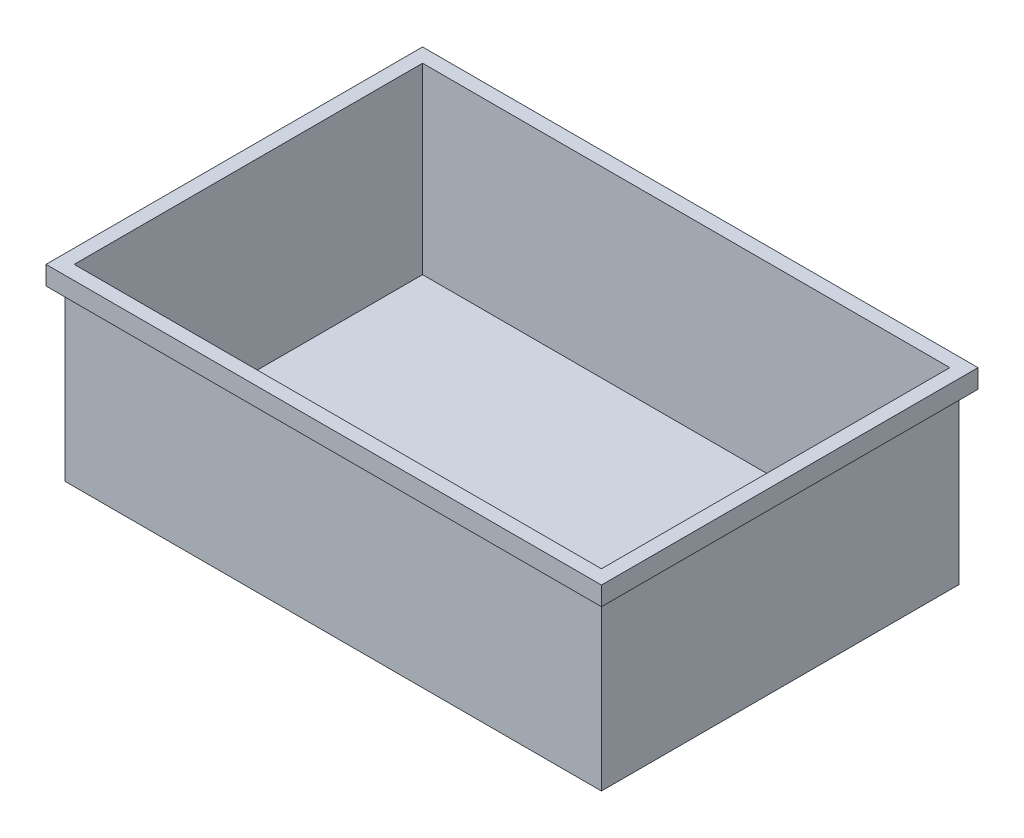
ISO-10303-21;
HEADER;
FILE_DESCRIPTION(('STEP AP214'),'2;1');
FILE_NAME('part.step','',(''),(''),'','','');
FILE_SCHEMA(('AUTOMOTIVE_DESIGN { 1 0 10303 214 1 1 1 1 }'));
ENDSEC;
DATA;
#1=APPLICATION_CONTEXT('core data for automotive mechanical design processes');
#2=APPLICATION_PROTOCOL_DEFINITION('international standard','automotive_design',2000,#1);
#3=PRODUCT_CONTEXT('',#1,'mechanical');
#4=PRODUCT('Part','Part','',(#3));
#5=PRODUCT_RELATED_PRODUCT_CATEGORY('part','',(#4));
#6=PRODUCT_DEFINITION_FORMATION('','',#4);
#7=PRODUCT_DEFINITION_CONTEXT('part definition',#1,'design');
#8=PRODUCT_DEFINITION('design','',#6,#7);
#9=PRODUCT_DEFINITION_SHAPE('','',#8);
#10=(LENGTH_UNIT() NAMED_UNIT(*) SI_UNIT(.MILLI.,.METRE.));
#11=(NAMED_UNIT(*) PLANE_ANGLE_UNIT() SI_UNIT($,.RADIAN.));
#12=(NAMED_UNIT(*) SI_UNIT($,.STERADIAN.) SOLID_ANGLE_UNIT());
#13=UNCERTAINTY_MEASURE_WITH_UNIT(LENGTH_MEASURE(1.E-05),#10,'distance_accuracy_value','');
#14=(GEOMETRIC_REPRESENTATION_CONTEXT(3) GLOBAL_UNCERTAINTY_ASSIGNED_CONTEXT((#13)) GLOBAL_UNIT_ASSIGNED_CONTEXT((#10,
#11,#12)) REPRESENTATION_CONTEXT('',''));
#15=CARTESIAN_POINT('',(0.,0.,0.));
#16=DIRECTION('',(0.,0.,1.));
#17=DIRECTION('',(1.,0.,0.));
#18=AXIS2_PLACEMENT_3D('',#15,#16,#17);
#19=CARTESIAN_POINT('',(0.,80.,0.));
#20=DIRECTION('',(0.,-1.,0.));
#21=DIRECTION('',(0.,0.,-1.));
#22=AXIS2_PLACEMENT_3D('',#19,#20,#21);
#23=PLANE('',#22);
#24=DIRECTION('',(0.,0.,1.));
#25=VECTOR('',#24,1.);
#26=CARTESIAN_POINT('',(2.,80.,0.));
#27=LINE('',#26,#25);
#28=CARTESIAN_POINT('',(2.,80.,-150.4));
#29=VERTEX_POINT('',#28);
#30=CARTESIAN_POINT('',(2.,80.,-2.));
#31=VERTEX_POINT('',#30);
#32=EDGE_CURVE('E216',#29,#31,#27,.T.);
#33=ORIENTED_EDGE('',*,*,#32,.F.);
#34=DIRECTION('',(-1.,0.,0.));
#35=VECTOR('',#34,1.);
#36=CARTESIAN_POINT('',(0.,80.,-150.4));
#37=LINE('',#36,#35);
#38=CARTESIAN_POINT('',(226.6,80.,-150.4));
#39=VERTEX_POINT('',#38);
#40=EDGE_CURVE('E205',#39,#29,#37,.T.);
#41=ORIENTED_EDGE('',*,*,#40,.F.);
#42=DIRECTION('',(0.,0.,-1.));
#43=VECTOR('',#42,1.);
#44=CARTESIAN_POINT('',(226.6,80.,-1.65076468097153E-13));
#45=LINE('',#44,#43);
#46=CARTESIAN_POINT('',(226.6,80.,-2.));
#47=VERTEX_POINT('',#46);
#48=EDGE_CURVE('E220',#47,#39,#45,.T.);
#49=ORIENTED_EDGE('',*,*,#48,.F.);
#50=DIRECTION('',(1.,0.,0.));
#51=VECTOR('',#50,1.);
#52=CARTESIAN_POINT('',(0.,80.,-2.));
#53=LINE('',#52,#51);
#54=EDGE_CURVE('E218',#31,#47,#53,.T.);
#55=ORIENTED_EDGE('',*,*,#54,.F.);
#56=EDGE_LOOP('',(#33,#41,#49,#55));
#57=FACE_BOUND('',#56,.T.);
#58=DIRECTION('',(1.,0.,0.));
#59=VECTOR('',#58,1.);
#60=CARTESIAN_POINT('',(-4.,80.,4.));
#61=LINE('',#60,#59);
#62=CARTESIAN_POINT('',(-4.,80.,4.));
#63=VERTEX_POINT('',#62);
#64=CARTESIAN_POINT('',(232.6,80.,4.));
#65=VERTEX_POINT('',#64);
#66=EDGE_CURVE('E269',#63,#65,#61,.T.);
#67=ORIENTED_EDGE('',*,*,#66,.T.);
#68=DIRECTION('',(0.,0.,-1.));
#69=VECTOR('',#68,1.);
#70=CARTESIAN_POINT('',(232.6,80.,4.));
#71=LINE('',#70,#69);
#72=CARTESIAN_POINT('',(232.6,80.,-156.4));
#73=VERTEX_POINT('',#72);
#74=EDGE_CURVE('E271',#65,#73,#71,.T.);
#75=ORIENTED_EDGE('',*,*,#74,.T.);
#76=DIRECTION('',(-1.,0.,0.));
#77=VECTOR('',#76,1.);
#78=CARTESIAN_POINT('',(232.6,80.,-156.4));
#79=LINE('',#78,#77);
#80=CARTESIAN_POINT('',(-4.,80.,-156.4));
#81=VERTEX_POINT('',#80);
#82=EDGE_CURVE('E184',#73,#81,#79,.T.);
#83=ORIENTED_EDGE('',*,*,#82,.T.);
#84=DIRECTION('',(0.,0.,1.));
#85=VECTOR('',#84,1.);
#86=CARTESIAN_POINT('',(-4.,80.,-156.4));
#87=LINE('',#86,#85);
#88=EDGE_CURVE('E190',#81,#63,#87,.T.);
#89=ORIENTED_EDGE('',*,*,#88,.T.);
#90=EDGE_LOOP('',(#67,#75,#83,#89));
#91=FACE_BOUND('',#90,.T.);
#92=ADVANCED_FACE('F43',(#57,#91),#23,.F.);
#93=CARTESIAN_POINT('',(2.,80.,0.));
#94=DIRECTION('',(1.,0.,0.));
#95=DIRECTION('',(0.,0.,-1.));
#96=AXIS2_PLACEMENT_3D('',#93,#94,#95);
#97=PLANE('',#96);
#98=DIRECTION('',(0.,-1.,0.));
#99=VECTOR('',#98,1.);
#100=CARTESIAN_POINT('',(2.,80.,-2.));
#101=LINE('',#100,#99);
#102=CARTESIAN_POINT('',(2.,2.,-2.));
#103=VERTEX_POINT('',#102);
#104=EDGE_CURVE('E198',#31,#103,#101,.T.);
#105=ORIENTED_EDGE('',*,*,#104,.T.);
#106=DIRECTION('',(0.,0.,1.));
#107=VECTOR('',#106,1.);
#108=CARTESIAN_POINT('',(2.,2.,0.));
#109=LINE('',#108,#107);
#110=CARTESIAN_POINT('',(2.,2.,-150.4));
#111=VERTEX_POINT('',#110);
#112=EDGE_CURVE('E194',#111,#103,#109,.T.);
#113=ORIENTED_EDGE('',*,*,#112,.F.);
#114=DIRECTION('',(0.,-1.,0.));
#115=VECTOR('',#114,1.);
#116=CARTESIAN_POINT('',(2.,80.,-150.4));
#117=LINE('',#116,#115);
#118=EDGE_CURVE('E202',#29,#111,#117,.T.);
#119=ORIENTED_EDGE('',*,*,#118,.F.);
#120=ORIENTED_EDGE('',*,*,#32,.T.);
#121=EDGE_LOOP('',(#105,#113,#119,#120));
#122=FACE_BOUND('',#121,.T.);
#123=ADVANCED_FACE('F282',(#122),#97,.T.);
#124=CARTESIAN_POINT('',(0.,80.,-2.));
#125=DIRECTION('',(0.,0.,-1.));
#126=DIRECTION('',(-1.,0.,0.));
#127=AXIS2_PLACEMENT_3D('',#124,#125,#126);
#128=PLANE('',#127);
#129=DIRECTION('',(0.,-1.,0.));
#130=VECTOR('',#129,1.);
#131=CARTESIAN_POINT('',(226.6,80.,-2.));
#132=LINE('',#131,#130);
#133=CARTESIAN_POINT('',(226.6,2.,-2.));
#134=VERTEX_POINT('',#133);
#135=EDGE_CURVE('E201',#47,#134,#132,.T.);
#136=ORIENTED_EDGE('',*,*,#135,.T.);
#137=DIRECTION('',(1.,0.,0.));
#138=VECTOR('',#137,1.);
#139=CARTESIAN_POINT('',(0.,2.,-2.));
#140=LINE('',#139,#138);
#141=EDGE_CURVE('E197',#103,#134,#140,.T.);
#142=ORIENTED_EDGE('',*,*,#141,.F.);
#143=ORIENTED_EDGE('',*,*,#104,.F.);
#144=ORIENTED_EDGE('',*,*,#54,.T.);
#145=EDGE_LOOP('',(#136,#142,#143,#144));
#146=FACE_BOUND('',#145,.T.);
#147=ADVANCED_FACE('F290',(#146),#128,.T.);
#148=CARTESIAN_POINT('',(226.6,80.,0.));
#149=DIRECTION('',(-1.,0.,0.));
#150=DIRECTION('',(0.,0.,1.));
#151=AXIS2_PLACEMENT_3D('',#148,#149,#150);
#152=PLANE('',#151);
#153=DIRECTION('',(0.,-1.,0.));
#154=VECTOR('',#153,1.);
#155=CARTESIAN_POINT('',(226.6,80.,-150.4));
#156=LINE('',#155,#154);
#157=CARTESIAN_POINT('',(226.6,2.,-150.4));
#158=VERTEX_POINT('',#157);
#159=EDGE_CURVE('E204',#39,#158,#156,.T.);
#160=ORIENTED_EDGE('',*,*,#159,.T.);
#161=DIRECTION('',(0.,0.,-1.));
#162=VECTOR('',#161,1.);
#163=CARTESIAN_POINT('',(226.6,2.,-1.65076468097153E-13));
#164=LINE('',#163,#162);
#165=EDGE_CURVE('E208',#134,#158,#164,.T.);
#166=ORIENTED_EDGE('',*,*,#165,.F.);
#167=ORIENTED_EDGE('',*,*,#135,.F.);
#168=ORIENTED_EDGE('',*,*,#48,.T.);
#169=EDGE_LOOP('',(#160,#166,#167,#168));
#170=FACE_BOUND('',#169,.T.);
#171=ADVANCED_FACE('F414',(#170),#152,.T.);
#172=CARTESIAN_POINT('',(0.,80.,-150.4));
#173=DIRECTION('',(0.,0.,1.));
#174=DIRECTION('',(1.,0.,0.));
#175=AXIS2_PLACEMENT_3D('',#172,#173,#174);
#176=PLANE('',#175);
#177=ORIENTED_EDGE('',*,*,#118,.T.);
#178=DIRECTION('',(-1.,0.,0.));
#179=VECTOR('',#178,1.);
#180=CARTESIAN_POINT('',(0.,2.,-150.4));
#181=LINE('',#180,#179);
#182=EDGE_CURVE('E212',#158,#111,#181,.T.);
#183=ORIENTED_EDGE('',*,*,#182,.F.);
#184=ORIENTED_EDGE('',*,*,#159,.F.);
#185=ORIENTED_EDGE('',*,*,#40,.T.);
#186=EDGE_LOOP('',(#177,#183,#184,#185));
#187=FACE_BOUND('',#186,.T.);
#188=ADVANCED_FACE('F410',(#187),#176,.T.);
#189=CARTESIAN_POINT('',(0.,2.,0.));
#190=DIRECTION('',(0.,-1.,0.));
#191=DIRECTION('',(0.,0.,-1.));
#192=AXIS2_PLACEMENT_3D('',#189,#190,#191);
#193=PLANE('',#192);
#194=ORIENTED_EDGE('',*,*,#112,.T.);
#195=ORIENTED_EDGE('',*,*,#141,.T.);
#196=ORIENTED_EDGE('',*,*,#165,.T.);
#197=ORIENTED_EDGE('',*,*,#182,.T.);
#198=EDGE_LOOP('',(#194,#195,#196,#197));
#199=FACE_BOUND('',#198,.T.);
#200=ADVANCED_FACE('F296',(#199),#193,.F.);
#201=CARTESIAN_POINT('',(-4.,70.,4.));
#202=DIRECTION('',(0.,0.,1.));
#203=DIRECTION('',(1.,0.,0.));
#204=AXIS2_PLACEMENT_3D('',#201,#202,#203);
#205=PLANE('',#204);
#206=DIRECTION('',(0.,1.,0.));
#207=VECTOR('',#206,1.);
#208=CARTESIAN_POINT('',(-4.,70.,4.));
#209=LINE('',#208,#207);
#210=CARTESIAN_POINT('',(-4.,72.,4.));
#211=VERTEX_POINT('',#210);
#212=EDGE_CURVE('E188',#211,#63,#209,.T.);
#213=ORIENTED_EDGE('',*,*,#212,.F.);
#214=DIRECTION('',(1.,0.,0.));
#215=VECTOR('',#214,1.);
#216=CARTESIAN_POINT('',(232.6,72.,4.));
#217=LINE('',#216,#215);
#218=CARTESIAN_POINT('',(232.6,72.,4.));
#219=VERTEX_POINT('',#218);
#220=EDGE_CURVE('E11',#211,#219,#217,.T.);
#221=ORIENTED_EDGE('',*,*,#220,.T.);
#222=DIRECTION('',(0.,1.,0.));
#223=VECTOR('',#222,1.);
#224=CARTESIAN_POINT('',(232.6,70.,4.));
#225=LINE('',#224,#223);
#226=EDGE_CURVE('E92',#219,#65,#225,.T.);
#227=ORIENTED_EDGE('',*,*,#226,.T.);
#228=ORIENTED_EDGE('',*,*,#66,.F.);
#229=EDGE_LOOP('',(#213,#221,#227,#228));
#230=FACE_BOUND('',#229,.T.);
#231=ADVANCED_FACE('F280',(#230),#205,.T.);
#232=CARTESIAN_POINT('',(-4.,70.,-156.4));
#233=DIRECTION('',(-1.,0.,0.));
#234=DIRECTION('',(0.,0.,1.));
#235=AXIS2_PLACEMENT_3D('',#232,#233,#234);
#236=PLANE('',#235);
#237=DIRECTION('',(0.,1.,0.));
#238=VECTOR('',#237,1.);
#239=CARTESIAN_POINT('',(-4.,70.,-156.4));
#240=LINE('',#239,#238);
#241=CARTESIAN_POINT('',(-4.,72.,-156.4));
#242=VERTEX_POINT('',#241);
#243=EDGE_CURVE('E186',#242,#81,#240,.T.);
#244=ORIENTED_EDGE('',*,*,#243,.F.);
#245=DIRECTION('',(0.,0.,1.));
#246=VECTOR('',#245,1.);
#247=CARTESIAN_POINT('',(-4.,72.,4.));
#248=LINE('',#247,#246);
#249=EDGE_CURVE('E54',#242,#211,#248,.T.);
#250=ORIENTED_EDGE('',*,*,#249,.T.);
#251=ORIENTED_EDGE('',*,*,#212,.T.);
#252=ORIENTED_EDGE('',*,*,#88,.F.);
#253=EDGE_LOOP('',(#244,#250,#251,#252));
#254=FACE_BOUND('',#253,.T.);
#255=ADVANCED_FACE('F279',(#254),#236,.T.);
#256=CARTESIAN_POINT('',(232.6,70.,-156.4));
#257=DIRECTION('',(0.,0.,-1.));
#258=DIRECTION('',(-1.,0.,0.));
#259=AXIS2_PLACEMENT_3D('',#256,#257,#258);
#260=PLANE('',#259);
#261=DIRECTION('',(0.,1.,0.));
#262=VECTOR('',#261,1.);
#263=CARTESIAN_POINT('',(232.6,70.,-156.4));
#264=LINE('',#263,#262);
#265=CARTESIAN_POINT('',(232.6,72.,-156.4));
#266=VERTEX_POINT('',#265);
#267=EDGE_CURVE('E177',#266,#73,#264,.T.);
#268=ORIENTED_EDGE('',*,*,#267,.F.);
#269=DIRECTION('',(-1.,0.,0.));
#270=VECTOR('',#269,1.);
#271=CARTESIAN_POINT('',(-4.,72.,-156.4));
#272=LINE('',#271,#270);
#273=EDGE_CURVE('E170',#266,#242,#272,.T.);
#274=ORIENTED_EDGE('',*,*,#273,.T.);
#275=ORIENTED_EDGE('',*,*,#243,.T.);
#276=ORIENTED_EDGE('',*,*,#82,.F.);
#277=EDGE_LOOP('',(#268,#274,#275,#276));
#278=FACE_BOUND('',#277,.T.);
#279=ADVANCED_FACE('F182',(#278),#260,.T.);
#280=CARTESIAN_POINT('',(232.6,70.,4.));
#281=DIRECTION('',(1.,0.,0.));
#282=DIRECTION('',(0.,0.,-1.));
#283=AXIS2_PLACEMENT_3D('',#280,#281,#282);
#284=PLANE('',#283);
#285=ORIENTED_EDGE('',*,*,#226,.F.);
#286=DIRECTION('',(0.,0.,-1.));
#287=VECTOR('',#286,1.);
#288=CARTESIAN_POINT('',(232.6,72.,-156.4));
#289=LINE('',#288,#287);
#290=EDGE_CURVE('E160',#219,#266,#289,.T.);
#291=ORIENTED_EDGE('',*,*,#290,.T.);
#292=ORIENTED_EDGE('',*,*,#267,.T.);
#293=ORIENTED_EDGE('',*,*,#74,.F.);
#294=EDGE_LOOP('',(#285,#291,#292,#293));
#295=FACE_BOUND('',#294,.T.);
#296=ADVANCED_FACE('F176',(#295),#284,.T.);
#297=CARTESIAN_POINT('',(0.,0.,0.));
#298=DIRECTION('',(0.,-1.,0.));
#299=DIRECTION('',(0.,0.,-1.));
#300=AXIS2_PLACEMENT_3D('',#297,#298,#299);
#301=PLANE('',#300);
#302=DIRECTION('',(0.,0.,1.));
#303=VECTOR('',#302,1.);
#304=CARTESIAN_POINT('',(0.,0.,0.));
#305=LINE('',#304,#303);
#306=CARTESIAN_POINT('',(0.,0.,-152.4));
#307=VERTEX_POINT('',#306);
#308=CARTESIAN_POINT('',(0.,0.,0.));
#309=VERTEX_POINT('',#308);
#310=EDGE_CURVE('E200',#307,#309,#305,.T.);
#311=ORIENTED_EDGE('',*,*,#310,.F.);
#312=DIRECTION('',(-1.,0.,0.));
#313=VECTOR('',#312,1.);
#314=CARTESIAN_POINT('',(0.,0.,-152.4));
#315=LINE('',#314,#313);
#316=CARTESIAN_POINT('',(228.6,0.,-152.4));
#317=VERTEX_POINT('',#316);
#318=EDGE_CURVE('E232',#317,#307,#315,.T.);
#319=ORIENTED_EDGE('',*,*,#318,.F.);
#320=DIRECTION('',(0.,0.,-1.));
#321=VECTOR('',#320,1.);
#322=CARTESIAN_POINT('',(228.6,0.,0.));
#323=LINE('',#322,#321);
#324=CARTESIAN_POINT('',(228.6,0.,0.));
#325=VERTEX_POINT('',#324);
#326=EDGE_CURVE('E229',#325,#317,#323,.T.);
#327=ORIENTED_EDGE('',*,*,#326,.F.);
#328=DIRECTION('',(1.,0.,0.));
#329=VECTOR('',#328,1.);
#330=CARTESIAN_POINT('',(0.,0.,0.));
#331=LINE('',#330,#329);
#332=EDGE_CURVE('E226',#309,#325,#331,.T.);
#333=ORIENTED_EDGE('',*,*,#332,.F.);
#334=EDGE_LOOP('',(#311,#319,#327,#333));
#335=FACE_BOUND('',#334,.T.);
#336=ADVANCED_FACE('F298',(#335),#301,.T.);
#337=CARTESIAN_POINT('',(0.,80.,-152.4));
#338=DIRECTION('',(0.,0.,1.));
#339=DIRECTION('',(1.,0.,0.));
#340=AXIS2_PLACEMENT_3D('',#337,#338,#339);
#341=PLANE('',#340);
#342=DIRECTION('',(0.,-1.,0.));
#343=VECTOR('',#342,1.);
#344=CARTESIAN_POINT('',(0.,80.,-152.4));
#345=LINE('',#344,#343);
#346=CARTESIAN_POINT('',(0.,68.,-152.4));
#347=VERTEX_POINT('',#346);
#348=EDGE_CURVE('E235',#347,#307,#345,.T.);
#349=ORIENTED_EDGE('',*,*,#348,.F.);
#350=DIRECTION('',(1.,0.,0.));
#351=VECTOR('',#350,1.);
#352=CARTESIAN_POINT('',(228.6,68.,-152.4));
#353=LINE('',#352,#351);
#354=CARTESIAN_POINT('',(228.6,68.,-152.4));
#355=VERTEX_POINT('',#354);
#356=EDGE_CURVE('E180',#347,#355,#353,.T.);
#357=ORIENTED_EDGE('',*,*,#356,.T.);
#358=DIRECTION('',(0.,-1.,0.));
#359=VECTOR('',#358,1.);
#360=CARTESIAN_POINT('',(228.6,80.,-152.4));
#361=LINE('',#360,#359);
#362=EDGE_CURVE('E237',#355,#317,#361,.T.);
#363=ORIENTED_EDGE('',*,*,#362,.T.);
#364=ORIENTED_EDGE('',*,*,#318,.T.);
#365=EDGE_LOOP('',(#349,#357,#363,#364));
#366=FACE_BOUND('',#365,.T.);
#367=ADVANCED_FACE('F301',(#366),#341,.F.);
#368=CARTESIAN_POINT('',(228.6,80.,0.));
#369=DIRECTION('',(-1.,0.,0.));
#370=DIRECTION('',(0.,0.,1.));
#371=AXIS2_PLACEMENT_3D('',#368,#369,#370);
#372=PLANE('',#371);
#373=ORIENTED_EDGE('',*,*,#362,.F.);
#374=DIRECTION('',(0.,0.,1.));
#375=VECTOR('',#374,1.);
#376=CARTESIAN_POINT('',(228.6,68.,0.));
#377=LINE('',#376,#375);
#378=CARTESIAN_POINT('',(228.6,68.,0.));
#379=VERTEX_POINT('',#378);
#380=EDGE_CURVE('E243',#355,#379,#377,.T.);
#381=ORIENTED_EDGE('',*,*,#380,.T.);
#382=DIRECTION('',(0.,-1.,0.));
#383=VECTOR('',#382,1.);
#384=CARTESIAN_POINT('',(228.6,80.,0.));
#385=LINE('',#384,#383);
#386=EDGE_CURVE('E239',#379,#325,#385,.T.);
#387=ORIENTED_EDGE('',*,*,#386,.T.);
#388=ORIENTED_EDGE('',*,*,#326,.T.);
#389=EDGE_LOOP('',(#373,#381,#387,#388));
#390=FACE_BOUND('',#389,.T.);
#391=ADVANCED_FACE('F305',(#390),#372,.F.);
#392=CARTESIAN_POINT('',(0.,80.,0.));
#393=DIRECTION('',(0.,0.,-1.));
#394=DIRECTION('',(-1.,0.,0.));
#395=AXIS2_PLACEMENT_3D('',#392,#393,#394);
#396=PLANE('',#395);
#397=ORIENTED_EDGE('',*,*,#386,.F.);
#398=DIRECTION('',(-1.,0.,0.));
#399=VECTOR('',#398,1.);
#400=CARTESIAN_POINT('',(0.,68.,0.));
#401=LINE('',#400,#399);
#402=CARTESIAN_POINT('',(0.,68.,0.));
#403=VERTEX_POINT('',#402);
#404=EDGE_CURVE('E246',#379,#403,#401,.T.);
#405=ORIENTED_EDGE('',*,*,#404,.T.);
#406=DIRECTION('',(0.,-1.,0.));
#407=VECTOR('',#406,1.);
#408=CARTESIAN_POINT('',(0.,80.,0.));
#409=LINE('',#408,#407);
#410=EDGE_CURVE('E241',#403,#309,#409,.T.);
#411=ORIENTED_EDGE('',*,*,#410,.T.);
#412=ORIENTED_EDGE('',*,*,#332,.T.);
#413=EDGE_LOOP('',(#397,#405,#411,#412));
#414=FACE_BOUND('',#413,.T.);
#415=ADVANCED_FACE('F309',(#414),#396,.F.);
#416=CARTESIAN_POINT('',(0.,80.,0.));
#417=DIRECTION('',(1.,0.,0.));
#418=DIRECTION('',(0.,0.,-1.));
#419=AXIS2_PLACEMENT_3D('',#416,#417,#418);
#420=PLANE('',#419);
#421=ORIENTED_EDGE('',*,*,#410,.F.);
#422=DIRECTION('',(0.,0.,-1.));
#423=VECTOR('',#422,1.);
#424=CARTESIAN_POINT('',(0.,68.,-152.4));
#425=LINE('',#424,#423);
#426=EDGE_CURVE('E248',#403,#347,#425,.T.);
#427=ORIENTED_EDGE('',*,*,#426,.T.);
#428=ORIENTED_EDGE('',*,*,#348,.T.);
#429=ORIENTED_EDGE('',*,*,#310,.T.);
#430=EDGE_LOOP('',(#421,#427,#428,#429));
#431=FACE_BOUND('',#430,.T.);
#432=ADVANCED_FACE('F313',(#431),#420,.F.);
#433=CARTESIAN_POINT('',(-4.,72.,-156.4));
#434=DIRECTION('',(-0.707106781186538,-0.707106781186557,0.));
#435=DIRECTION('',(0.,0.,-1.));
#436=AXIS2_PLACEMENT_3D('',#433,#434,#435);
#437=PLANE('',#436);
#438=DIRECTION('',(0.577350269189631,-0.577350269189615,-0.577350269189631));
#439=VECTOR('',#438,1.);
#440=CARTESIAN_POINT('',(-4.,72.,4.));
#441=LINE('',#440,#439);
#442=CARTESIAN_POINT('',(-2.,70.,2.));
#443=VERTEX_POINT('',#442);
#444=EDGE_CURVE('E48',#211,#443,#441,.T.);
#445=ORIENTED_EDGE('',*,*,#444,.F.);
#446=ORIENTED_EDGE('',*,*,#249,.F.);
#447=DIRECTION('',(0.577350269189631,-0.577350269189615,0.577350269189631));
#448=VECTOR('',#447,1.);
#449=CARTESIAN_POINT('',(-4.,72.,-156.4));
#450=LINE('',#449,#448);
#451=CARTESIAN_POINT('',(-2.,70.,-154.4));
#452=VERTEX_POINT('',#451);
#453=EDGE_CURVE('E79',#452,#242,#450,.F.);
#454=ORIENTED_EDGE('',*,*,#453,.F.);
#455=DIRECTION('',(0.,0.,-1.));
#456=VECTOR('',#455,1.);
#457=CARTESIAN_POINT('',(-1.99999999999994,70.,-156.4));
#458=LINE('',#457,#456);
#459=EDGE_CURVE('E268',#443,#452,#458,.T.);
#460=ORIENTED_EDGE('',*,*,#459,.F.);
#461=EDGE_LOOP('',(#445,#446,#454,#460));
#462=FACE_BOUND('',#461,.T.);
#463=ADVANCED_FACE('F46',(#462),#437,.T.);
#464=CARTESIAN_POINT('',(-4.,72.,4.));
#465=DIRECTION('',(0.,-0.707106781186557,0.707106781186538));
#466=DIRECTION('',(-1.,0.,0.));
#467=AXIS2_PLACEMENT_3D('',#464,#465,#466);
#468=PLANE('',#467);
#469=ORIENTED_EDGE('',*,*,#220,.F.);
#470=ORIENTED_EDGE('',*,*,#444,.T.);
#471=DIRECTION('',(-1.,0.,0.));
#472=VECTOR('',#471,1.);
#473=CARTESIAN_POINT('',(-4.,70.,1.99999999999994));
#474=LINE('',#473,#472);
#475=CARTESIAN_POINT('',(230.6,70.,2.));
#476=VERTEX_POINT('',#475);
#477=EDGE_CURVE('E262',#476,#443,#474,.T.);
#478=ORIENTED_EDGE('',*,*,#477,.F.);
#479=DIRECTION('',(0.577350269189631,0.577350269189615,0.577350269189631));
#480=VECTOR('',#479,1.);
#481=CARTESIAN_POINT('',(153.733333333332,-6.86666666666594,-74.8666666666681));
#482=LINE('',#481,#480);
#483=EDGE_CURVE('E167',#219,#476,#482,.F.);
#484=ORIENTED_EDGE('',*,*,#483,.F.);
#485=EDGE_LOOP('',(#469,#470,#478,#484));
#486=FACE_BOUND('',#485,.T.);
#487=ADVANCED_FACE('F356',(#486),#468,.T.);
#488=CARTESIAN_POINT('',(232.6,72.,-156.4));
#489=DIRECTION('',(0.,-0.707106781186557,-0.707106781186538));
#490=DIRECTION('',(1.,0.,0.));
#491=AXIS2_PLACEMENT_3D('',#488,#489,#490);
#492=PLANE('',#491);
#493=ORIENTED_EDGE('',*,*,#453,.T.);
#494=ORIENTED_EDGE('',*,*,#273,.F.);
#495=DIRECTION('',(-0.57735026918963,-0.577350269189615,0.577350269189631));
#496=VECTOR('',#495,1.);
#497=CARTESIAN_POINT('',(232.6,72.,-156.4));
#498=LINE('',#497,#496);
#499=CARTESIAN_POINT('',(230.6,70.,-154.4));
#500=VERTEX_POINT('',#499);
#501=EDGE_CURVE('E155',#500,#266,#498,.F.);
#502=ORIENTED_EDGE('',*,*,#501,.F.);
#503=DIRECTION('',(1.,0.,0.));
#504=VECTOR('',#503,1.);
#505=CARTESIAN_POINT('',(232.6,70.,-154.4));
#506=LINE('',#505,#504);
#507=EDGE_CURVE('E168',#452,#500,#506,.T.);
#508=ORIENTED_EDGE('',*,*,#507,.F.);
#509=EDGE_LOOP('',(#493,#494,#502,#508));
#510=FACE_BOUND('',#509,.T.);
#511=ADVANCED_FACE('F171',(#510),#492,.T.);
#512=CARTESIAN_POINT('',(-2.,70.,0.));
#513=DIRECTION('',(-0.707106781186547,-0.707106781186547,0.));
#514=DIRECTION('',(0.,0.,-1.));
#515=AXIS2_PLACEMENT_3D('',#512,#513,#514);
#516=PLANE('',#515);
#517=DIRECTION('',(-0.577350269189626,0.577350269189626,-0.577350269189626));
#518=VECTOR('',#517,1.);
#519=CARTESIAN_POINT('',(-1.33333333333333,69.3333333333333,-153.733333333333));
#520=LINE('',#519,#518);
#521=EDGE_CURVE('E257',#347,#452,#520,.T.);
#522=ORIENTED_EDGE('',*,*,#521,.F.);
#523=ORIENTED_EDGE('',*,*,#426,.F.);
#524=DIRECTION('',(-0.577350269189626,0.577350269189626,0.577350269189626));
#525=VECTOR('',#524,1.);
#526=CARTESIAN_POINT('',(-1.33333333333333,69.3333333333333,1.33333333333333));
#527=LINE('',#526,#525);
#528=EDGE_CURVE('E265',#443,#403,#527,.F.);
#529=ORIENTED_EDGE('',*,*,#528,.F.);
#530=ORIENTED_EDGE('',*,*,#459,.T.);
#531=EDGE_LOOP('',(#522,#523,#529,#530));
#532=FACE_BOUND('',#531,.T.);
#533=ADVANCED_FACE('F344',(#532),#516,.T.);
#534=CARTESIAN_POINT('',(0.,70.,2.));
#535=DIRECTION('',(0.,-0.707106781186547,0.707106781186547));
#536=DIRECTION('',(-1.,0.,0.));
#537=AXIS2_PLACEMENT_3D('',#534,#535,#536);
#538=PLANE('',#537);
#539=ORIENTED_EDGE('',*,*,#528,.T.);
#540=ORIENTED_EDGE('',*,*,#404,.F.);
#541=DIRECTION('',(0.577350269189626,0.577350269189626,0.577350269189626));
#542=VECTOR('',#541,1.);
#543=CARTESIAN_POINT('',(153.733333333333,-6.8666666666667,-74.8666666666667));
#544=LINE('',#543,#542);
#545=EDGE_CURVE('E255',#476,#379,#544,.F.);
#546=ORIENTED_EDGE('',*,*,#545,.F.);
#547=ORIENTED_EDGE('',*,*,#477,.T.);
#548=EDGE_LOOP('',(#539,#540,#546,#547));
#549=FACE_BOUND('',#548,.T.);
#550=ADVANCED_FACE('F338',(#549),#538,.T.);
#551=CARTESIAN_POINT('',(232.6,72.,4.));
#552=DIRECTION('',(0.707106781186538,-0.707106781186557,0.));
#553=DIRECTION('',(0.,0.,1.));
#554=AXIS2_PLACEMENT_3D('',#551,#552,#553);
#555=PLANE('',#554);
#556=ORIENTED_EDGE('',*,*,#290,.F.);
#557=ORIENTED_EDGE('',*,*,#483,.T.);
#558=DIRECTION('',(0.,0.,1.));
#559=VECTOR('',#558,1.);
#560=CARTESIAN_POINT('',(230.6,70.,4.));
#561=LINE('',#560,#559);
#562=EDGE_CURVE('E162',#500,#476,#561,.T.);
#563=ORIENTED_EDGE('',*,*,#562,.F.);
#564=ORIENTED_EDGE('',*,*,#501,.T.);
#565=EDGE_LOOP('',(#556,#557,#563,#564));
#566=FACE_BOUND('',#565,.T.);
#567=ADVANCED_FACE('F157',(#566),#555,.T.);
#568=CARTESIAN_POINT('',(0.,70.,-154.4));
#569=DIRECTION('',(0.,-0.707106781186547,-0.707106781186547));
#570=DIRECTION('',(1.,0.,0.));
#571=AXIS2_PLACEMENT_3D('',#568,#569,#570);
#572=PLANE('',#571);
#573=ORIENTED_EDGE('',*,*,#521,.T.);
#574=ORIENTED_EDGE('',*,*,#507,.T.);
#575=DIRECTION('',(-0.577350269189626,-0.577350269189626,0.577350269189626));
#576=VECTOR('',#575,1.);
#577=CARTESIAN_POINT('',(153.733333333333,-6.86666666666663,-77.5333333333334));
#578=LINE('',#577,#576);
#579=EDGE_CURVE('E252',#355,#500,#578,.F.);
#580=ORIENTED_EDGE('',*,*,#579,.F.);
#581=ORIENTED_EDGE('',*,*,#356,.F.);
#582=EDGE_LOOP('',(#573,#574,#580,#581));
#583=FACE_BOUND('',#582,.T.);
#584=ADVANCED_FACE('F325',(#583),#572,.T.);
#585=CARTESIAN_POINT('',(230.6,70.,-1.67990439290395E-13));
#586=DIRECTION('',(0.707106781186547,-0.707106781186547,0.));
#587=DIRECTION('',(0.,0.,1.));
#588=AXIS2_PLACEMENT_3D('',#585,#586,#587);
#589=PLANE('',#588);
#590=ORIENTED_EDGE('',*,*,#545,.T.);
#591=ORIENTED_EDGE('',*,*,#380,.F.);
#592=ORIENTED_EDGE('',*,*,#579,.T.);
#593=ORIENTED_EDGE('',*,*,#562,.T.);
#594=EDGE_LOOP('',(#590,#591,#592,#593));
#595=FACE_BOUND('',#594,.T.);
#596=ADVANCED_FACE('F319',(#595),#589,.T.);
#597=CLOSED_SHELL('',(#92,#123,#147,#171,#188,#200,#231,#255,#279,#296,#336,#367,#391,#415,#432,
#463,#487,#511,#533,#550,#567,#584,#596));
#598=MANIFOLD_SOLID_BREP('B2',#597);
#599=ADVANCED_BREP_SHAPE_REPRESENTATION('',(#18,#598),#14);
#600=SHAPE_DEFINITION_REPRESENTATION(#9,#599);
ENDSEC;
END-ISO-10303-21;
